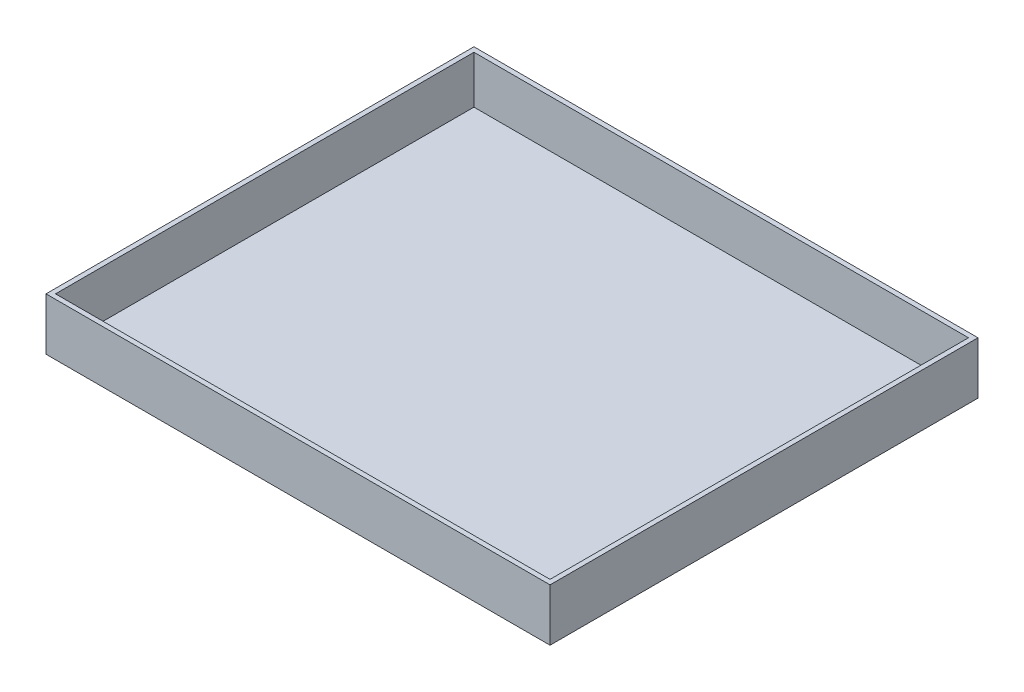
ISO-10303-21;
HEADER;
FILE_DESCRIPTION(('STEP AP214'),'2;1');
FILE_NAME('part.step','',(''),(''),'','','');
FILE_SCHEMA(('AUTOMOTIVE_DESIGN { 1 0 10303 214 1 1 1 1 }'));
ENDSEC;
DATA;
#1=APPLICATION_CONTEXT('core data for automotive mechanical design processes');
#2=APPLICATION_PROTOCOL_DEFINITION('international standard','automotive_design',2000,#1);
#3=PRODUCT_CONTEXT('',#1,'mechanical');
#4=PRODUCT('Part','Part','',(#3));
#5=PRODUCT_RELATED_PRODUCT_CATEGORY('part','',(#4));
#6=PRODUCT_DEFINITION_FORMATION('','',#4);
#7=PRODUCT_DEFINITION_CONTEXT('part definition',#1,'design');
#8=PRODUCT_DEFINITION('design','',#6,#7);
#9=PRODUCT_DEFINITION_SHAPE('','',#8);
#10=(LENGTH_UNIT() NAMED_UNIT(*) SI_UNIT(.MILLI.,.METRE.));
#11=(NAMED_UNIT(*) PLANE_ANGLE_UNIT() SI_UNIT($,.RADIAN.));
#12=(NAMED_UNIT(*) SI_UNIT($,.STERADIAN.) SOLID_ANGLE_UNIT());
#13=UNCERTAINTY_MEASURE_WITH_UNIT(LENGTH_MEASURE(1.E-05),#10,'distance_accuracy_value','');
#14=(GEOMETRIC_REPRESENTATION_CONTEXT(3) GLOBAL_UNCERTAINTY_ASSIGNED_CONTEXT((#13)) GLOBAL_UNIT_ASSIGNED_CONTEXT((#10,
#11,#12)) REPRESENTATION_CONTEXT('',''));
#15=CARTESIAN_POINT('',(0.,0.,0.));
#16=DIRECTION('',(0.,0.,1.));
#17=DIRECTION('',(1.,0.,0.));
#18=AXIS2_PLACEMENT_3D('',#15,#16,#17);
#19=CARTESIAN_POINT('',(-265.,-50.,225.));
#20=DIRECTION('',(-1.,0.,0.));
#21=DIRECTION('',(0.,0.,1.));
#22=AXIS2_PLACEMENT_3D('',#19,#20,#21);
#23=PLANE('',#22);
#24=DIRECTION('',(0.,0.,1.));
#25=VECTOR('',#24,1.);
#26=CARTESIAN_POINT('',(-265.,0.,225.));
#27=LINE('',#26,#25);
#28=CARTESIAN_POINT('',(-265.,0.,-225.));
#29=VERTEX_POINT('',#28);
#30=CARTESIAN_POINT('',(-265.,0.,225.));
#31=VERTEX_POINT('',#30);
#32=EDGE_CURVE('E169',#29,#31,#27,.T.);
#33=ORIENTED_EDGE('',*,*,#32,.F.);
#34=DIRECTION('',(0.,1.,0.));
#35=VECTOR('',#34,1.);
#36=CARTESIAN_POINT('',(-265.,-50.,-225.));
#37=LINE('',#36,#35);
#38=CARTESIAN_POINT('',(-265.,-55.,-225.));
#39=VERTEX_POINT('',#38);
#40=EDGE_CURVE('E12',#39,#29,#37,.T.);
#41=ORIENTED_EDGE('',*,*,#40,.F.);
#42=DIRECTION('',(0.,0.,-1.));
#43=VECTOR('',#42,1.);
#44=CARTESIAN_POINT('',(-265.,-55.,225.));
#45=LINE('',#44,#43);
#46=CARTESIAN_POINT('',(-265.,-55.,225.));
#47=VERTEX_POINT('',#46);
#48=EDGE_CURVE('E131',#47,#39,#45,.T.);
#49=ORIENTED_EDGE('',*,*,#48,.F.);
#50=DIRECTION('',(0.,1.,0.));
#51=VECTOR('',#50,1.);
#52=CARTESIAN_POINT('',(-265.,-50.,225.));
#53=LINE('',#52,#51);
#54=EDGE_CURVE('E58',#47,#31,#53,.T.);
#55=ORIENTED_EDGE('',*,*,#54,.T.);
#56=EDGE_LOOP('',(#33,#41,#49,#55));
#57=FACE_BOUND('',#56,.T.);
#58=ADVANCED_FACE('F55',(#57),#23,.T.);
#59=CARTESIAN_POINT('',(265.,-50.,-225.));
#60=DIRECTION('',(0.,0.,-1.));
#61=DIRECTION('',(-1.,0.,0.));
#62=AXIS2_PLACEMENT_3D('',#59,#60,#61);
#63=PLANE('',#62);
#64=DIRECTION('',(-1.,0.,0.));
#65=VECTOR('',#64,1.);
#66=CARTESIAN_POINT('',(265.,0.,-225.));
#67=LINE('',#66,#65);
#68=CARTESIAN_POINT('',(265.,0.,-225.));
#69=VERTEX_POINT('',#68);
#70=EDGE_CURVE('E129',#69,#29,#67,.T.);
#71=ORIENTED_EDGE('',*,*,#70,.F.);
#72=DIRECTION('',(0.,1.,0.));
#73=VECTOR('',#72,1.);
#74=CARTESIAN_POINT('',(265.,-50.,-225.));
#75=LINE('',#74,#73);
#76=CARTESIAN_POINT('',(265.,-55.,-225.));
#77=VERTEX_POINT('',#76);
#78=EDGE_CURVE('E63',#77,#69,#75,.T.);
#79=ORIENTED_EDGE('',*,*,#78,.F.);
#80=DIRECTION('',(1.,0.,0.));
#81=VECTOR('',#80,1.);
#82=CARTESIAN_POINT('',(-265.,-55.,-225.));
#83=LINE('',#82,#81);
#84=EDGE_CURVE('E134',#39,#77,#83,.T.);
#85=ORIENTED_EDGE('',*,*,#84,.F.);
#86=ORIENTED_EDGE('',*,*,#40,.T.);
#87=EDGE_LOOP('',(#71,#79,#85,#86));
#88=FACE_BOUND('',#87,.T.);
#89=ADVANCED_FACE('F187',(#88),#63,.T.);
#90=CARTESIAN_POINT('',(265.,-50.,225.));
#91=DIRECTION('',(1.,0.,0.));
#92=DIRECTION('',(0.,0.,-1.));
#93=AXIS2_PLACEMENT_3D('',#90,#91,#92);
#94=PLANE('',#93);
#95=DIRECTION('',(0.,0.,-1.));
#96=VECTOR('',#95,1.);
#97=CARTESIAN_POINT('',(265.,0.,225.));
#98=LINE('',#97,#96);
#99=CARTESIAN_POINT('',(265.,0.,225.));
#100=VERTEX_POINT('',#99);
#101=EDGE_CURVE('E177',#100,#69,#98,.T.);
#102=ORIENTED_EDGE('',*,*,#101,.F.);
#103=DIRECTION('',(0.,1.,0.));
#104=VECTOR('',#103,1.);
#105=CARTESIAN_POINT('',(265.,-50.,225.));
#106=LINE('',#105,#104);
#107=CARTESIAN_POINT('',(265.,-55.,225.));
#108=VERTEX_POINT('',#107);
#109=EDGE_CURVE('E128',#108,#100,#106,.T.);
#110=ORIENTED_EDGE('',*,*,#109,.F.);
#111=DIRECTION('',(0.,0.,1.));
#112=VECTOR('',#111,1.);
#113=CARTESIAN_POINT('',(265.,-55.,-225.));
#114=LINE('',#113,#112);
#115=EDGE_CURVE('E139',#77,#108,#114,.T.);
#116=ORIENTED_EDGE('',*,*,#115,.F.);
#117=ORIENTED_EDGE('',*,*,#78,.T.);
#118=EDGE_LOOP('',(#102,#110,#116,#117));
#119=FACE_BOUND('',#118,.T.);
#120=ADVANCED_FACE('F184',(#119),#94,.T.);
#121=CARTESIAN_POINT('',(265.,-50.,225.));
#122=DIRECTION('',(0.,0.,1.));
#123=DIRECTION('',(1.,0.,0.));
#124=AXIS2_PLACEMENT_3D('',#121,#122,#123);
#125=PLANE('',#124);
#126=DIRECTION('',(1.,0.,0.));
#127=VECTOR('',#126,1.);
#128=CARTESIAN_POINT('',(265.,0.,225.));
#129=LINE('',#128,#127);
#130=EDGE_CURVE('E125',#31,#100,#129,.T.);
#131=ORIENTED_EDGE('',*,*,#130,.F.);
#132=ORIENTED_EDGE('',*,*,#54,.F.);
#133=DIRECTION('',(-1.,0.,0.));
#134=VECTOR('',#133,1.);
#135=CARTESIAN_POINT('',(265.,-55.,225.));
#136=LINE('',#135,#134);
#137=EDGE_CURVE('E123',#108,#47,#136,.T.);
#138=ORIENTED_EDGE('',*,*,#137,.F.);
#139=ORIENTED_EDGE('',*,*,#109,.T.);
#140=EDGE_LOOP('',(#131,#132,#138,#139));
#141=FACE_BOUND('',#140,.T.);
#142=ADVANCED_FACE('F121',(#141),#125,.T.);
#143=CARTESIAN_POINT('',(-265.,0.,225.));
#144=DIRECTION('',(0.,1.,0.));
#145=DIRECTION('',(0.,0.,1.));
#146=AXIS2_PLACEMENT_3D('',#143,#144,#145);
#147=PLANE('',#146);
#148=DIRECTION('',(0.,0.,1.));
#149=VECTOR('',#148,1.);
#150=CARTESIAN_POINT('',(-260.,0.,225.));
#151=LINE('',#150,#149);
#152=CARTESIAN_POINT('',(-260.,0.,-220.));
#153=VERTEX_POINT('',#152);
#154=CARTESIAN_POINT('',(-260.,0.,220.));
#155=VERTEX_POINT('',#154);
#156=EDGE_CURVE('E71',#153,#155,#151,.T.);
#157=ORIENTED_EDGE('',*,*,#156,.F.);
#158=DIRECTION('',(-1.,0.,0.));
#159=VECTOR('',#158,1.);
#160=CARTESIAN_POINT('',(265.,0.,-220.));
#161=LINE('',#160,#159);
#162=CARTESIAN_POINT('',(260.,0.,-220.));
#163=VERTEX_POINT('',#162);
#164=EDGE_CURVE('E148',#163,#153,#161,.T.);
#165=ORIENTED_EDGE('',*,*,#164,.F.);
#166=DIRECTION('',(0.,0.,-1.));
#167=VECTOR('',#166,1.);
#168=CARTESIAN_POINT('',(260.,0.,225.));
#169=LINE('',#168,#167);
#170=CARTESIAN_POINT('',(260.,0.,220.));
#171=VERTEX_POINT('',#170);
#172=EDGE_CURVE('E162',#171,#163,#169,.T.);
#173=ORIENTED_EDGE('',*,*,#172,.F.);
#174=DIRECTION('',(1.,0.,0.));
#175=VECTOR('',#174,1.);
#176=CARTESIAN_POINT('',(265.,0.,220.));
#177=LINE('',#176,#175);
#178=EDGE_CURVE('E159',#155,#171,#177,.T.);
#179=ORIENTED_EDGE('',*,*,#178,.F.);
#180=EDGE_LOOP('',(#157,#165,#173,#179));
#181=FACE_BOUND('',#180,.T.);
#182=ORIENTED_EDGE('',*,*,#32,.T.);
#183=ORIENTED_EDGE('',*,*,#130,.T.);
#184=ORIENTED_EDGE('',*,*,#101,.T.);
#185=ORIENTED_EDGE('',*,*,#70,.T.);
#186=EDGE_LOOP('',(#182,#183,#184,#185));
#187=FACE_BOUND('',#186,.T.);
#188=ADVANCED_FACE('F186',(#181,#187),#147,.T.);
#189=CARTESIAN_POINT('',(-260.,-50.,225.));
#190=DIRECTION('',(-1.,0.,0.));
#191=DIRECTION('',(0.,0.,1.));
#192=AXIS2_PLACEMENT_3D('',#189,#190,#191);
#193=PLANE('',#192);
#194=ORIENTED_EDGE('',*,*,#156,.T.);
#195=DIRECTION('',(0.,1.,0.));
#196=VECTOR('',#195,1.);
#197=CARTESIAN_POINT('',(-260.,-50.,220.));
#198=LINE('',#197,#196);
#199=CARTESIAN_POINT('',(-260.,-50.,220.));
#200=VERTEX_POINT('',#199);
#201=EDGE_CURVE('E157',#200,#155,#198,.T.);
#202=ORIENTED_EDGE('',*,*,#201,.F.);
#203=DIRECTION('',(0.,0.,1.));
#204=VECTOR('',#203,1.);
#205=CARTESIAN_POINT('',(-260.,-50.,225.));
#206=LINE('',#205,#204);
#207=CARTESIAN_POINT('',(-260.,-50.,-220.));
#208=VERTEX_POINT('',#207);
#209=EDGE_CURVE('E144',#208,#200,#206,.T.);
#210=ORIENTED_EDGE('',*,*,#209,.F.);
#211=DIRECTION('',(0.,1.,0.));
#212=VECTOR('',#211,1.);
#213=CARTESIAN_POINT('',(-260.,-50.,-220.));
#214=LINE('',#213,#212);
#215=EDGE_CURVE('E167',#208,#153,#214,.T.);
#216=ORIENTED_EDGE('',*,*,#215,.T.);
#217=EDGE_LOOP('',(#194,#202,#210,#216));
#218=FACE_BOUND('',#217,.T.);
#219=ADVANCED_FACE('F201',(#218),#193,.F.);
#220=CARTESIAN_POINT('',(265.,-50.,-220.));
#221=DIRECTION('',(0.,0.,-1.));
#222=DIRECTION('',(-1.,0.,0.));
#223=AXIS2_PLACEMENT_3D('',#220,#221,#222);
#224=PLANE('',#223);
#225=ORIENTED_EDGE('',*,*,#164,.T.);
#226=ORIENTED_EDGE('',*,*,#215,.F.);
#227=DIRECTION('',(-1.,0.,0.));
#228=VECTOR('',#227,1.);
#229=CARTESIAN_POINT('',(265.,-50.,-220.));
#230=LINE('',#229,#228);
#231=CARTESIAN_POINT('',(260.,-50.,-220.));
#232=VERTEX_POINT('',#231);
#233=EDGE_CURVE('E154',#232,#208,#230,.T.);
#234=ORIENTED_EDGE('',*,*,#233,.F.);
#235=DIRECTION('',(0.,1.,0.));
#236=VECTOR('',#235,1.);
#237=CARTESIAN_POINT('',(260.,-50.,-220.));
#238=LINE('',#237,#236);
#239=EDGE_CURVE('E170',#232,#163,#238,.T.);
#240=ORIENTED_EDGE('',*,*,#239,.T.);
#241=EDGE_LOOP('',(#225,#226,#234,#240));
#242=FACE_BOUND('',#241,.T.);
#243=ADVANCED_FACE('F206',(#242),#224,.F.);
#244=CARTESIAN_POINT('',(260.,-50.,225.));
#245=DIRECTION('',(1.,0.,0.));
#246=DIRECTION('',(0.,0.,-1.));
#247=AXIS2_PLACEMENT_3D('',#244,#245,#246);
#248=PLANE('',#247);
#249=ORIENTED_EDGE('',*,*,#172,.T.);
#250=ORIENTED_EDGE('',*,*,#239,.F.);
#251=DIRECTION('',(0.,0.,-1.));
#252=VECTOR('',#251,1.);
#253=CARTESIAN_POINT('',(260.,-50.,225.));
#254=LINE('',#253,#252);
#255=CARTESIAN_POINT('',(260.,-50.,220.));
#256=VERTEX_POINT('',#255);
#257=EDGE_CURVE('E151',#256,#232,#254,.T.);
#258=ORIENTED_EDGE('',*,*,#257,.F.);
#259=DIRECTION('',(0.,1.,0.));
#260=VECTOR('',#259,1.);
#261=CARTESIAN_POINT('',(260.,-50.,220.));
#262=LINE('',#261,#260);
#263=EDGE_CURVE('E172',#256,#171,#262,.T.);
#264=ORIENTED_EDGE('',*,*,#263,.T.);
#265=EDGE_LOOP('',(#249,#250,#258,#264));
#266=FACE_BOUND('',#265,.T.);
#267=ADVANCED_FACE('F220',(#266),#248,.F.);
#268=CARTESIAN_POINT('',(265.,-50.,220.));
#269=DIRECTION('',(0.,0.,1.));
#270=DIRECTION('',(1.,0.,0.));
#271=AXIS2_PLACEMENT_3D('',#268,#269,#270);
#272=PLANE('',#271);
#273=ORIENTED_EDGE('',*,*,#178,.T.);
#274=ORIENTED_EDGE('',*,*,#263,.F.);
#275=DIRECTION('',(1.,0.,0.));
#276=VECTOR('',#275,1.);
#277=CARTESIAN_POINT('',(265.,-50.,220.));
#278=LINE('',#277,#276);
#279=EDGE_CURVE('E147',#200,#256,#278,.T.);
#280=ORIENTED_EDGE('',*,*,#279,.F.);
#281=ORIENTED_EDGE('',*,*,#201,.T.);
#282=EDGE_LOOP('',(#273,#274,#280,#281));
#283=FACE_BOUND('',#282,.T.);
#284=ADVANCED_FACE('F211',(#283),#272,.F.);
#285=CARTESIAN_POINT('',(-265.,-50.,225.));
#286=DIRECTION('',(0.,-1.,0.));
#287=DIRECTION('',(0.,0.,-1.));
#288=AXIS2_PLACEMENT_3D('',#285,#286,#287);
#289=PLANE('',#288);
#290=ORIENTED_EDGE('',*,*,#233,.T.);
#291=ORIENTED_EDGE('',*,*,#209,.T.);
#292=ORIENTED_EDGE('',*,*,#279,.T.);
#293=ORIENTED_EDGE('',*,*,#257,.T.);
#294=EDGE_LOOP('',(#290,#291,#292,#293));
#295=FACE_BOUND('',#294,.T.);
#296=ADVANCED_FACE('F217',(#295),#289,.F.);
#297=CARTESIAN_POINT('',(-265.,-55.,225.));
#298=DIRECTION('',(0.,-1.,0.));
#299=DIRECTION('',(0.,0.,-1.));
#300=AXIS2_PLACEMENT_3D('',#297,#298,#299);
#301=PLANE('',#300);
#302=ORIENTED_EDGE('',*,*,#137,.T.);
#303=ORIENTED_EDGE('',*,*,#48,.T.);
#304=ORIENTED_EDGE('',*,*,#84,.T.);
#305=ORIENTED_EDGE('',*,*,#115,.T.);
#306=EDGE_LOOP('',(#302,#303,#304,#305));
#307=FACE_BOUND('',#306,.T.);
#308=ADVANCED_FACE('F137',(#307),#301,.T.);
#309=CLOSED_SHELL('',(#58,#89,#120,#142,#188,#219,#243,#267,#284,#296,#308));
#310=MANIFOLD_SOLID_BREP('B2',#309);
#311=ADVANCED_BREP_SHAPE_REPRESENTATION('',(#18,#310),#14);
#312=SHAPE_DEFINITION_REPRESENTATION(#9,#311);
ENDSEC;
END-ISO-10303-21;
